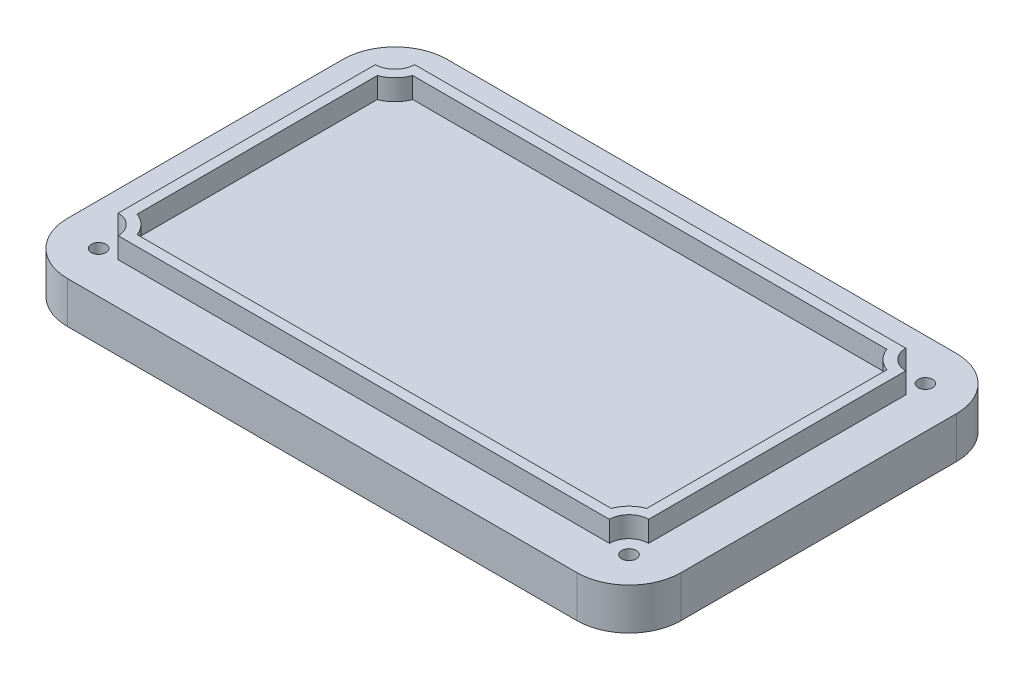
ISO-10303-21;
HEADER;
FILE_DESCRIPTION(('STEP AP214'),'2;1');
FILE_NAME('part.step','',(''),(''),'','','');
FILE_SCHEMA(('AUTOMOTIVE_DESIGN { 1 0 10303 214 1 1 1 1 }'));
ENDSEC;
DATA;
#1=APPLICATION_CONTEXT('core data for automotive mechanical design processes');
#2=APPLICATION_PROTOCOL_DEFINITION('international standard','automotive_design',2000,#1);
#3=PRODUCT_CONTEXT('',#1,'mechanical');
#4=PRODUCT('Part','Part','',(#3));
#5=PRODUCT_RELATED_PRODUCT_CATEGORY('part','',(#4));
#6=PRODUCT_DEFINITION_FORMATION('','',#4);
#7=PRODUCT_DEFINITION_CONTEXT('part definition',#1,'design');
#8=PRODUCT_DEFINITION('design','',#6,#7);
#9=PRODUCT_DEFINITION_SHAPE('','',#8);
#10=(LENGTH_UNIT() NAMED_UNIT(*) SI_UNIT(.MILLI.,.METRE.));
#11=(NAMED_UNIT(*) PLANE_ANGLE_UNIT() SI_UNIT($,.RADIAN.));
#12=(NAMED_UNIT(*) SI_UNIT($,.STERADIAN.) SOLID_ANGLE_UNIT());
#13=UNCERTAINTY_MEASURE_WITH_UNIT(LENGTH_MEASURE(1.E-05),#10,'distance_accuracy_value','');
#14=(GEOMETRIC_REPRESENTATION_CONTEXT(3) GLOBAL_UNCERTAINTY_ASSIGNED_CONTEXT((#13)) GLOBAL_UNIT_ASSIGNED_CONTEXT((#10,
#11,#12)) REPRESENTATION_CONTEXT('',''));
#15=CARTESIAN_POINT('',(0.,0.,0.));
#16=DIRECTION('',(0.,0.,1.));
#17=DIRECTION('',(1.,0.,0.));
#18=AXIS2_PLACEMENT_3D('',#15,#16,#17);
#19=CARTESIAN_POINT('',(-51.,8.,28.5));
#20=DIRECTION('',(0.,-1.,0.));
#21=DIRECTION('',(0.,0.,-1.));
#22=AXIS2_PLACEMENT_3D('',#19,#20,#21);
#23=CYLINDRICAL_SURFACE('',#22,1.4);
#24=CARTESIAN_POINT('',(-51.,8.,28.5));
#25=DIRECTION('',(0.,1.,0.));
#26=DIRECTION('',(0.,0.,1.));
#27=AXIS2_PLACEMENT_3D('',#24,#25,#26);
#28=CIRCLE('',#27,1.4);
#29=CARTESIAN_POINT('',(-51.,8.,29.9));
#30=VERTEX_POINT('',#29);
#31=EDGE_CURVE('E253',#30,#30,#28,.T.);
#32=ORIENTED_EDGE('',*,*,#31,.T.);
#33=EDGE_LOOP('',(#32));
#34=FACE_BOUND('',#33,.T.);
#35=CARTESIAN_POINT('',(-51.,3.,28.5));
#36=DIRECTION('',(0.,-1.,0.));
#37=DIRECTION('',(0.,0.,-1.));
#38=AXIS2_PLACEMENT_3D('',#35,#36,#37);
#39=CIRCLE('',#38,1.4);
#40=CARTESIAN_POINT('',(-51.,3.,27.1));
#41=VERTEX_POINT('',#40);
#42=EDGE_CURVE('E346',#41,#41,#39,.T.);
#43=ORIENTED_EDGE('',*,*,#42,.T.);
#44=EDGE_LOOP('',(#43));
#45=FACE_BOUND('',#44,.T.);
#46=ADVANCED_FACE('F41',(#34,#45),#23,.F.);
#47=CARTESIAN_POINT('',(51.,8.,-28.5));
#48=DIRECTION('',(0.,-1.,0.));
#49=DIRECTION('',(0.,0.,-1.));
#50=AXIS2_PLACEMENT_3D('',#47,#48,#49);
#51=CYLINDRICAL_SURFACE('',#50,1.4);
#52=CARTESIAN_POINT('',(51.,8.,-28.5));
#53=DIRECTION('',(0.,1.,0.));
#54=DIRECTION('',(0.,0.,1.));
#55=AXIS2_PLACEMENT_3D('',#52,#53,#54);
#56=CIRCLE('',#55,1.4);
#57=CARTESIAN_POINT('',(51.,8.,-27.1));
#58=VERTEX_POINT('',#57);
#59=EDGE_CURVE('E244',#58,#58,#56,.T.);
#60=ORIENTED_EDGE('',*,*,#59,.T.);
#61=EDGE_LOOP('',(#60));
#62=FACE_BOUND('',#61,.T.);
#63=CARTESIAN_POINT('',(51.,3.,-28.5));
#64=DIRECTION('',(0.,-1.,0.));
#65=DIRECTION('',(0.,0.,-1.));
#66=AXIS2_PLACEMENT_3D('',#63,#64,#65);
#67=CIRCLE('',#66,1.4);
#68=CARTESIAN_POINT('',(51.,3.,-29.9));
#69=VERTEX_POINT('',#68);
#70=EDGE_CURVE('E338',#69,#69,#67,.T.);
#71=ORIENTED_EDGE('',*,*,#70,.T.);
#72=EDGE_LOOP('',(#71));
#73=FACE_BOUND('',#72,.T.);
#74=ADVANCED_FACE('F43',(#62,#73),#51,.F.);
#75=CARTESIAN_POINT('',(59.,8.,0.));
#76=DIRECTION('',(-1.,0.,0.));
#77=DIRECTION('',(0.,0.,1.));
#78=AXIS2_PLACEMENT_3D('',#75,#76,#77);
#79=PLANE('',#78);
#80=DIRECTION('',(0.,0.,-1.));
#81=VECTOR('',#80,1.);
#82=CARTESIAN_POINT('',(59.,0.,0.));
#83=LINE('',#82,#81);
#84=CARTESIAN_POINT('',(59.,0.,26.5));
#85=VERTEX_POINT('',#84);
#86=CARTESIAN_POINT('',(59.,0.,-26.5));
#87=VERTEX_POINT('',#86);
#88=EDGE_CURVE('E287',#85,#87,#83,.T.);
#89=ORIENTED_EDGE('',*,*,#88,.T.);
#90=DIRECTION('',(0.,-1.,0.));
#91=VECTOR('',#90,1.);
#92=CARTESIAN_POINT('',(59.,8.,-26.5));
#93=LINE('',#92,#91);
#94=CARTESIAN_POINT('',(59.,8.,-26.5));
#95=VERTEX_POINT('',#94);
#96=EDGE_CURVE('E11',#95,#87,#93,.T.);
#97=ORIENTED_EDGE('',*,*,#96,.F.);
#98=DIRECTION('',(0.,0.,-1.));
#99=VECTOR('',#98,1.);
#100=CARTESIAN_POINT('',(59.,8.,0.));
#101=LINE('',#100,#99);
#102=CARTESIAN_POINT('',(59.,8.,26.5));
#103=VERTEX_POINT('',#102);
#104=EDGE_CURVE('E261',#103,#95,#101,.T.);
#105=ORIENTED_EDGE('',*,*,#104,.F.);
#106=DIRECTION('',(0.,-1.,0.));
#107=VECTOR('',#106,1.);
#108=CARTESIAN_POINT('',(59.,8.,26.5));
#109=LINE('',#108,#107);
#110=EDGE_CURVE('E286',#103,#85,#109,.T.);
#111=ORIENTED_EDGE('',*,*,#110,.T.);
#112=EDGE_LOOP('',(#89,#97,#105,#111));
#113=FACE_BOUND('',#112,.T.);
#114=ADVANCED_FACE('F558',(#113),#79,.F.);
#115=CARTESIAN_POINT('',(49.,8.,-26.5));
#116=DIRECTION('',(0.,-1.,0.));
#117=DIRECTION('',(0.,0.,-1.));
#118=AXIS2_PLACEMENT_3D('',#115,#116,#117);
#119=CYLINDRICAL_SURFACE('',#118,10.);
#120=CARTESIAN_POINT('',(49.,0.,-26.5));
#121=DIRECTION('',(0.,1.,0.));
#122=DIRECTION('',(0.,0.,1.));
#123=AXIS2_PLACEMENT_3D('',#120,#121,#122);
#124=CIRCLE('',#123,10.);
#125=CARTESIAN_POINT('',(49.,0.,-36.5));
#126=VERTEX_POINT('',#125);
#127=EDGE_CURVE('E291',#87,#126,#124,.T.);
#128=ORIENTED_EDGE('',*,*,#127,.T.);
#129=DIRECTION('',(0.,-1.,0.));
#130=VECTOR('',#129,1.);
#131=CARTESIAN_POINT('',(49.,8.,-36.5));
#132=LINE('',#131,#130);
#133=CARTESIAN_POINT('',(49.,8.,-36.5));
#134=VERTEX_POINT('',#133);
#135=EDGE_CURVE('E51',#134,#126,#132,.T.);
#136=ORIENTED_EDGE('',*,*,#135,.F.);
#137=CARTESIAN_POINT('',(49.,8.,-26.5));
#138=DIRECTION('',(0.,1.,0.));
#139=DIRECTION('',(0.,0.,1.));
#140=AXIS2_PLACEMENT_3D('',#137,#138,#139);
#141=CIRCLE('',#140,10.);
#142=EDGE_CURVE('E265',#95,#134,#141,.T.);
#143=ORIENTED_EDGE('',*,*,#142,.F.);
#144=ORIENTED_EDGE('',*,*,#96,.T.);
#145=EDGE_LOOP('',(#128,#136,#143,#144));
#146=FACE_BOUND('',#145,.T.);
#147=ADVANCED_FACE('F592',(#146),#119,.T.);
#148=CARTESIAN_POINT('',(0.,8.,-36.5));
#149=DIRECTION('',(0.,0.,1.));
#150=DIRECTION('',(1.,0.,0.));
#151=AXIS2_PLACEMENT_3D('',#148,#149,#150);
#152=PLANE('',#151);
#153=DIRECTION('',(-1.,0.,0.));
#154=VECTOR('',#153,1.);
#155=CARTESIAN_POINT('',(0.,0.,-36.5));
#156=LINE('',#155,#154);
#157=CARTESIAN_POINT('',(-49.,0.,-36.5));
#158=VERTEX_POINT('',#157);
#159=EDGE_CURVE('E295',#126,#158,#156,.T.);
#160=ORIENTED_EDGE('',*,*,#159,.T.);
#161=DIRECTION('',(0.,-1.,0.));
#162=VECTOR('',#161,1.);
#163=CARTESIAN_POINT('',(-49.,8.,-36.5));
#164=LINE('',#163,#162);
#165=CARTESIAN_POINT('',(-49.,8.,-36.5));
#166=VERTEX_POINT('',#165);
#167=EDGE_CURVE('E331',#166,#158,#164,.T.);
#168=ORIENTED_EDGE('',*,*,#167,.F.);
#169=DIRECTION('',(-1.,0.,0.));
#170=VECTOR('',#169,1.);
#171=CARTESIAN_POINT('',(0.,8.,-36.5));
#172=LINE('',#171,#170);
#173=EDGE_CURVE('E268',#134,#166,#172,.T.);
#174=ORIENTED_EDGE('',*,*,#173,.F.);
#175=ORIENTED_EDGE('',*,*,#135,.T.);
#176=EDGE_LOOP('',(#160,#168,#174,#175));
#177=FACE_BOUND('',#176,.T.);
#178=ADVANCED_FACE('F597',(#177),#152,.F.);
#179=CARTESIAN_POINT('',(-49.,8.,-26.5));
#180=DIRECTION('',(0.,-1.,0.));
#181=DIRECTION('',(0.,0.,-1.));
#182=AXIS2_PLACEMENT_3D('',#179,#180,#181);
#183=CYLINDRICAL_SURFACE('',#182,10.);
#184=CARTESIAN_POINT('',(-49.,0.,-26.5));
#185=DIRECTION('',(0.,1.,0.));
#186=DIRECTION('',(0.,0.,1.));
#187=AXIS2_PLACEMENT_3D('',#184,#185,#186);
#188=CIRCLE('',#187,10.);
#189=CARTESIAN_POINT('',(-59.,0.,-26.5));
#190=VERTEX_POINT('',#189);
#191=EDGE_CURVE('E298',#158,#190,#188,.T.);
#192=ORIENTED_EDGE('',*,*,#191,.T.);
#193=DIRECTION('',(0.,-1.,0.));
#194=VECTOR('',#193,1.);
#195=CARTESIAN_POINT('',(-59.,8.,-26.5));
#196=LINE('',#195,#194);
#197=CARTESIAN_POINT('',(-59.,8.,-26.5));
#198=VERTEX_POINT('',#197);
#199=EDGE_CURVE('E327',#198,#190,#196,.T.);
#200=ORIENTED_EDGE('',*,*,#199,.F.);
#201=CARTESIAN_POINT('',(-49.,8.,-26.5));
#202=DIRECTION('',(0.,1.,0.));
#203=DIRECTION('',(0.,0.,1.));
#204=AXIS2_PLACEMENT_3D('',#201,#202,#203);
#205=CIRCLE('',#204,10.);
#206=EDGE_CURVE('E271',#166,#198,#205,.T.);
#207=ORIENTED_EDGE('',*,*,#206,.F.);
#208=ORIENTED_EDGE('',*,*,#167,.T.);
#209=EDGE_LOOP('',(#192,#200,#207,#208));
#210=FACE_BOUND('',#209,.T.);
#211=ADVANCED_FACE('F603',(#210),#183,.T.);
#212=CARTESIAN_POINT('',(-59.,8.,0.));
#213=DIRECTION('',(1.,0.,0.));
#214=DIRECTION('',(0.,0.,-1.));
#215=AXIS2_PLACEMENT_3D('',#212,#213,#214);
#216=PLANE('',#215);
#217=DIRECTION('',(0.,0.,1.));
#218=VECTOR('',#217,1.);
#219=CARTESIAN_POINT('',(-59.,0.,0.));
#220=LINE('',#219,#218);
#221=CARTESIAN_POINT('',(-59.,0.,26.5));
#222=VERTEX_POINT('',#221);
#223=EDGE_CURVE('E301',#190,#222,#220,.T.);
#224=ORIENTED_EDGE('',*,*,#223,.T.);
#225=DIRECTION('',(0.,-1.,0.));
#226=VECTOR('',#225,1.);
#227=CARTESIAN_POINT('',(-59.,8.,26.5));
#228=LINE('',#227,#226);
#229=CARTESIAN_POINT('',(-59.,8.,26.5));
#230=VERTEX_POINT('',#229);
#231=EDGE_CURVE('E323',#230,#222,#228,.T.);
#232=ORIENTED_EDGE('',*,*,#231,.F.);
#233=DIRECTION('',(0.,0.,1.));
#234=VECTOR('',#233,1.);
#235=CARTESIAN_POINT('',(-59.,8.,0.));
#236=LINE('',#235,#234);
#237=EDGE_CURVE('E274',#198,#230,#236,.T.);
#238=ORIENTED_EDGE('',*,*,#237,.F.);
#239=ORIENTED_EDGE('',*,*,#199,.T.);
#240=EDGE_LOOP('',(#224,#232,#238,#239));
#241=FACE_BOUND('',#240,.T.);
#242=ADVANCED_FACE('F607',(#241),#216,.F.);
#243=CARTESIAN_POINT('',(-49.,8.,26.5));
#244=DIRECTION('',(0.,-1.,0.));
#245=DIRECTION('',(0.,0.,-1.));
#246=AXIS2_PLACEMENT_3D('',#243,#244,#245);
#247=CYLINDRICAL_SURFACE('',#246,10.);
#248=CARTESIAN_POINT('',(-49.,0.,26.5));
#249=DIRECTION('',(0.,1.,0.));
#250=DIRECTION('',(0.,0.,1.));
#251=AXIS2_PLACEMENT_3D('',#248,#249,#250);
#252=CIRCLE('',#251,10.);
#253=CARTESIAN_POINT('',(-49.,0.,36.5));
#254=VERTEX_POINT('',#253);
#255=EDGE_CURVE('E304',#222,#254,#252,.T.);
#256=ORIENTED_EDGE('',*,*,#255,.T.);
#257=DIRECTION('',(0.,-1.,0.));
#258=VECTOR('',#257,1.);
#259=CARTESIAN_POINT('',(-49.,8.,36.5));
#260=LINE('',#259,#258);
#261=CARTESIAN_POINT('',(-49.,8.,36.5));
#262=VERTEX_POINT('',#261);
#263=EDGE_CURVE('E319',#262,#254,#260,.T.);
#264=ORIENTED_EDGE('',*,*,#263,.F.);
#265=CARTESIAN_POINT('',(-49.,8.,26.5));
#266=DIRECTION('',(0.,1.,0.));
#267=DIRECTION('',(0.,0.,1.));
#268=AXIS2_PLACEMENT_3D('',#265,#266,#267);
#269=CIRCLE('',#268,10.);
#270=EDGE_CURVE('E277',#230,#262,#269,.T.);
#271=ORIENTED_EDGE('',*,*,#270,.F.);
#272=ORIENTED_EDGE('',*,*,#231,.T.);
#273=EDGE_LOOP('',(#256,#264,#271,#272));
#274=FACE_BOUND('',#273,.T.);
#275=ADVANCED_FACE('F612',(#274),#247,.T.);
#276=CARTESIAN_POINT('',(0.,8.,36.5));
#277=DIRECTION('',(0.,0.,-1.));
#278=DIRECTION('',(-1.,0.,0.));
#279=AXIS2_PLACEMENT_3D('',#276,#277,#278);
#280=PLANE('',#279);
#281=DIRECTION('',(1.,0.,0.));
#282=VECTOR('',#281,1.);
#283=CARTESIAN_POINT('',(0.,0.,36.5));
#284=LINE('',#283,#282);
#285=CARTESIAN_POINT('',(49.,0.,36.5));
#286=VERTEX_POINT('',#285);
#287=EDGE_CURVE('E307',#254,#286,#284,.T.);
#288=ORIENTED_EDGE('',*,*,#287,.T.);
#289=DIRECTION('',(0.,-1.,0.));
#290=VECTOR('',#289,1.);
#291=CARTESIAN_POINT('',(49.,8.,36.5));
#292=LINE('',#291,#290);
#293=CARTESIAN_POINT('',(49.,8.,36.5));
#294=VERTEX_POINT('',#293);
#295=EDGE_CURVE('E315',#294,#286,#292,.T.);
#296=ORIENTED_EDGE('',*,*,#295,.F.);
#297=DIRECTION('',(1.,0.,0.));
#298=VECTOR('',#297,1.);
#299=CARTESIAN_POINT('',(0.,8.,36.5));
#300=LINE('',#299,#298);
#301=EDGE_CURVE('E280',#262,#294,#300,.T.);
#302=ORIENTED_EDGE('',*,*,#301,.F.);
#303=ORIENTED_EDGE('',*,*,#263,.T.);
#304=EDGE_LOOP('',(#288,#296,#302,#303));
#305=FACE_BOUND('',#304,.T.);
#306=ADVANCED_FACE('F616',(#305),#280,.F.);
#307=CARTESIAN_POINT('',(49.,8.,26.5));
#308=DIRECTION('',(0.,-1.,0.));
#309=DIRECTION('',(0.,0.,-1.));
#310=AXIS2_PLACEMENT_3D('',#307,#308,#309);
#311=CYLINDRICAL_SURFACE('',#310,10.);
#312=CARTESIAN_POINT('',(49.,0.,26.5));
#313=DIRECTION('',(0.,1.,0.));
#314=DIRECTION('',(0.,0.,1.));
#315=AXIS2_PLACEMENT_3D('',#312,#313,#314);
#316=CIRCLE('',#315,10.);
#317=EDGE_CURVE('E249',#286,#85,#316,.T.);
#318=ORIENTED_EDGE('',*,*,#317,.T.);
#319=ORIENTED_EDGE('',*,*,#110,.F.);
#320=CARTESIAN_POINT('',(49.,8.,26.5));
#321=DIRECTION('',(0.,1.,0.));
#322=DIRECTION('',(0.,0.,1.));
#323=AXIS2_PLACEMENT_3D('',#320,#321,#322);
#324=CIRCLE('',#323,10.);
#325=EDGE_CURVE('E283',#294,#103,#324,.T.);
#326=ORIENTED_EDGE('',*,*,#325,.F.);
#327=ORIENTED_EDGE('',*,*,#295,.T.);
#328=EDGE_LOOP('',(#318,#319,#326,#327));
#329=FACE_BOUND('',#328,.T.);
#330=ADVANCED_FACE('F573',(#329),#311,.T.);
#331=CARTESIAN_POINT('',(-51.,8.,-28.5));
#332=DIRECTION('',(0.,-1.,0.));
#333=DIRECTION('',(0.,0.,-1.));
#334=AXIS2_PLACEMENT_3D('',#331,#332,#333);
#335=CYLINDRICAL_SURFACE('',#334,1.4);
#336=CARTESIAN_POINT('',(-51.,3.,-28.5));
#337=DIRECTION('',(0.,1.,0.));
#338=DIRECTION('',(0.,0.,1.));
#339=AXIS2_PLACEMENT_3D('',#336,#337,#338);
#340=CIRCLE('',#339,1.4);
#341=CARTESIAN_POINT('',(-51.,3.,-27.1));
#342=VERTEX_POINT('',#341);
#343=EDGE_CURVE('E45',#342,#342,#340,.T.);
#344=ORIENTED_EDGE('',*,*,#343,.F.);
#345=EDGE_LOOP('',(#344));
#346=FACE_BOUND('',#345,.T.);
#347=CARTESIAN_POINT('',(-51.,8.,-28.5));
#348=DIRECTION('',(0.,1.,0.));
#349=DIRECTION('',(0.,0.,1.));
#350=AXIS2_PLACEMENT_3D('',#347,#348,#349);
#351=CIRCLE('',#350,1.4);
#352=CARTESIAN_POINT('',(-51.,8.,-27.1));
#353=VERTEX_POINT('',#352);
#354=EDGE_CURVE('E257',#353,#353,#351,.T.);
#355=ORIENTED_EDGE('',*,*,#354,.T.);
#356=EDGE_LOOP('',(#355));
#357=FACE_BOUND('',#356,.T.);
#358=ADVANCED_FACE('F561',(#346,#357),#335,.F.);
#359=CARTESIAN_POINT('',(51.,8.,28.5));
#360=DIRECTION('',(0.,-1.,0.));
#361=DIRECTION('',(0.,0.,-1.));
#362=AXIS2_PLACEMENT_3D('',#359,#360,#361);
#363=CYLINDRICAL_SURFACE('',#362,1.4);
#364=CARTESIAN_POINT('',(51.,3.,28.5));
#365=DIRECTION('',(0.,1.,0.));
#366=DIRECTION('',(0.,0.,1.));
#367=AXIS2_PLACEMENT_3D('',#364,#365,#366);
#368=CIRCLE('',#367,1.4);
#369=CARTESIAN_POINT('',(51.,3.,29.9));
#370=VERTEX_POINT('',#369);
#371=EDGE_CURVE('E342',#370,#370,#368,.T.);
#372=ORIENTED_EDGE('',*,*,#371,.F.);
#373=EDGE_LOOP('',(#372));
#374=FACE_BOUND('',#373,.T.);
#375=CARTESIAN_POINT('',(51.,8.,28.5));
#376=DIRECTION('',(0.,1.,0.));
#377=DIRECTION('',(0.,0.,1.));
#378=AXIS2_PLACEMENT_3D('',#375,#376,#377);
#379=CIRCLE('',#378,1.4);
#380=CARTESIAN_POINT('',(51.,8.,29.9));
#381=VERTEX_POINT('',#380);
#382=EDGE_CURVE('E248',#381,#381,#379,.T.);
#383=ORIENTED_EDGE('',*,*,#382,.T.);
#384=EDGE_LOOP('',(#383));
#385=FACE_BOUND('',#384,.T.);
#386=ADVANCED_FACE('F563',(#374,#385),#363,.F.);
#387=CARTESIAN_POINT('',(0.,8.,0.));
#388=DIRECTION('',(0.,1.,0.));
#389=DIRECTION('',(0.,0.,1.));
#390=AXIS2_PLACEMENT_3D('',#387,#388,#389);
#391=PLANE('',#390);
#392=DIRECTION('',(-1.,0.,0.));
#393=VECTOR('',#392,1.);
#394=CARTESIAN_POINT('',(0.,8.,-28.5));
#395=LINE('',#394,#393);
#396=CARTESIAN_POINT('',(47.2349327781439,8.,-28.5));
#397=VERTEX_POINT('',#396);
#398=CARTESIAN_POINT('',(-47.2349327781439,8.,-28.5));
#399=VERTEX_POINT('',#398);
#400=EDGE_CURVE('E356',#397,#399,#395,.T.);
#401=ORIENTED_EDGE('',*,*,#400,.F.);
#402=CARTESIAN_POINT('',(51.,8.,-28.5));
#403=DIRECTION('',(0.,1.,0.));
#404=DIRECTION('',(0.,0.,1.));
#405=AXIS2_PLACEMENT_3D('',#402,#403,#404);
#406=CIRCLE('',#405,3.76506722185612);
#407=CARTESIAN_POINT('',(51.,8.,-24.7349327781439));
#408=VERTEX_POINT('',#407);
#409=EDGE_CURVE('E231',#408,#397,#406,.F.);
#410=ORIENTED_EDGE('',*,*,#409,.F.);
#411=DIRECTION('',(0.,0.,-1.));
#412=VECTOR('',#411,1.);
#413=CARTESIAN_POINT('',(51.,8.,0.));
#414=LINE('',#413,#412);
#415=CARTESIAN_POINT('',(51.,8.,24.7349327781439));
#416=VERTEX_POINT('',#415);
#417=EDGE_CURVE('E379',#416,#408,#414,.T.);
#418=ORIENTED_EDGE('',*,*,#417,.F.);
#419=CARTESIAN_POINT('',(50.9999999999999,8.,28.5));
#420=DIRECTION('',(0.,1.,0.));
#421=DIRECTION('',(0.,0.,1.));
#422=AXIS2_PLACEMENT_3D('',#419,#420,#421);
#423=CIRCLE('',#422,3.76506722185613);
#424=CARTESIAN_POINT('',(47.2349327781438,8.,28.5));
#425=VERTEX_POINT('',#424);
#426=EDGE_CURVE('E376',#425,#416,#423,.F.);
#427=ORIENTED_EDGE('',*,*,#426,.F.);
#428=DIRECTION('',(1.,0.,0.));
#429=VECTOR('',#428,1.);
#430=CARTESIAN_POINT('',(0.,8.,28.5));
#431=LINE('',#430,#429);
#432=CARTESIAN_POINT('',(-47.2349327781439,8.,28.5));
#433=VERTEX_POINT('',#432);
#434=EDGE_CURVE('E373',#433,#425,#431,.T.);
#435=ORIENTED_EDGE('',*,*,#434,.F.);
#436=CARTESIAN_POINT('',(-51.,8.,28.5));
#437=DIRECTION('',(0.,1.,0.));
#438=DIRECTION('',(0.,0.,1.));
#439=AXIS2_PLACEMENT_3D('',#436,#437,#438);
#440=CIRCLE('',#439,3.76506722185612);
#441=CARTESIAN_POINT('',(-51.,8.,24.7349327781439));
#442=VERTEX_POINT('',#441);
#443=EDGE_CURVE('E370',#442,#433,#440,.F.);
#444=ORIENTED_EDGE('',*,*,#443,.F.);
#445=DIRECTION('',(0.,0.,1.));
#446=VECTOR('',#445,1.);
#447=CARTESIAN_POINT('',(-51.,8.,0.));
#448=LINE('',#447,#446);
#449=CARTESIAN_POINT('',(-51.,8.,-24.7349327781439));
#450=VERTEX_POINT('',#449);
#451=EDGE_CURVE('E367',#450,#442,#448,.T.);
#452=ORIENTED_EDGE('',*,*,#451,.F.);
#453=CARTESIAN_POINT('',(-51.,8.,-28.5));
#454=DIRECTION('',(0.,1.,0.));
#455=DIRECTION('',(0.,0.,1.));
#456=AXIS2_PLACEMENT_3D('',#453,#454,#455);
#457=CIRCLE('',#456,3.76506722185612);
#458=EDGE_CURVE('E359',#399,#450,#457,.F.);
#459=ORIENTED_EDGE('',*,*,#458,.F.);
#460=EDGE_LOOP('',(#401,#410,#418,#427,#435,#444,#452,#459));
#461=FACE_BOUND('',#460,.T.);
#462=ORIENTED_EDGE('',*,*,#59,.F.);
#463=EDGE_LOOP('',(#462));
#464=FACE_BOUND('',#463,.T.);
#465=ORIENTED_EDGE('',*,*,#382,.F.);
#466=EDGE_LOOP('',(#465));
#467=FACE_BOUND('',#466,.T.);
#468=ORIENTED_EDGE('',*,*,#31,.F.);
#469=EDGE_LOOP('',(#468));
#470=FACE_BOUND('',#469,.T.);
#471=ORIENTED_EDGE('',*,*,#354,.F.);
#472=EDGE_LOOP('',(#471));
#473=FACE_BOUND('',#472,.T.);
#474=ORIENTED_EDGE('',*,*,#104,.T.);
#475=ORIENTED_EDGE('',*,*,#142,.T.);
#476=ORIENTED_EDGE('',*,*,#173,.T.);
#477=ORIENTED_EDGE('',*,*,#206,.T.);
#478=ORIENTED_EDGE('',*,*,#237,.T.);
#479=ORIENTED_EDGE('',*,*,#270,.T.);
#480=ORIENTED_EDGE('',*,*,#301,.T.);
#481=ORIENTED_EDGE('',*,*,#325,.T.);
#482=EDGE_LOOP('',(#474,#475,#476,#477,#478,#479,#480,#481));
#483=FACE_BOUND('',#482,.T.);
#484=ADVANCED_FACE('F459',(#461,#464,#467,#470,#473,#483),#391,.T.);
#485=CARTESIAN_POINT('',(0.,0.,0.));
#486=DIRECTION('',(0.,1.,0.));
#487=DIRECTION('',(0.,0.,1.));
#488=AXIS2_PLACEMENT_3D('',#485,#486,#487);
#489=PLANE('',#488);
#490=CARTESIAN_POINT('',(-51.,0.,-28.5));
#491=DIRECTION('',(0.,-1.,0.));
#492=DIRECTION('',(0.,0.,1.));
#493=AXIS2_PLACEMENT_3D('',#490,#491,#492);
#494=CIRCLE('',#493,3.5);
#495=CARTESIAN_POINT('',(-51.,0.,-25.));
#496=VERTEX_POINT('',#495);
#497=EDGE_CURVE('E969',#496,#496,#494,.T.);
#498=ORIENTED_EDGE('',*,*,#497,.F.);
#499=EDGE_LOOP('',(#498));
#500=FACE_BOUND('',#499,.T.);
#501=CARTESIAN_POINT('',(51.,0.,-28.5));
#502=DIRECTION('',(0.,-1.,0.));
#503=DIRECTION('',(0.,0.,-1.));
#504=AXIS2_PLACEMENT_3D('',#501,#502,#503);
#505=CIRCLE('',#504,3.5);
#506=CARTESIAN_POINT('',(51.,0.,-32.));
#507=VERTEX_POINT('',#506);
#508=EDGE_CURVE('E977',#507,#507,#505,.T.);
#509=ORIENTED_EDGE('',*,*,#508,.F.);
#510=EDGE_LOOP('',(#509));
#511=FACE_BOUND('',#510,.T.);
#512=CARTESIAN_POINT('',(51.,0.,28.5));
#513=DIRECTION('',(0.,-1.,0.));
#514=DIRECTION('',(0.,0.,1.));
#515=AXIS2_PLACEMENT_3D('',#512,#513,#514);
#516=CIRCLE('',#515,3.5);
#517=CARTESIAN_POINT('',(51.,0.,32.));
#518=VERTEX_POINT('',#517);
#519=EDGE_CURVE('E985',#518,#518,#516,.T.);
#520=ORIENTED_EDGE('',*,*,#519,.F.);
#521=EDGE_LOOP('',(#520));
#522=FACE_BOUND('',#521,.T.);
#523=CARTESIAN_POINT('',(-51.,0.,28.5));
#524=DIRECTION('',(0.,-1.,0.));
#525=DIRECTION('',(0.,0.,-1.));
#526=AXIS2_PLACEMENT_3D('',#523,#524,#525);
#527=CIRCLE('',#526,3.5);
#528=CARTESIAN_POINT('',(-51.,0.,25.));
#529=VERTEX_POINT('',#528);
#530=EDGE_CURVE('E961',#529,#529,#527,.T.);
#531=ORIENTED_EDGE('',*,*,#530,.F.);
#532=EDGE_LOOP('',(#531));
#533=FACE_BOUND('',#532,.T.);
#534=ORIENTED_EDGE('',*,*,#88,.F.);
#535=ORIENTED_EDGE('',*,*,#317,.F.);
#536=ORIENTED_EDGE('',*,*,#287,.F.);
#537=ORIENTED_EDGE('',*,*,#255,.F.);
#538=ORIENTED_EDGE('',*,*,#223,.F.);
#539=ORIENTED_EDGE('',*,*,#191,.F.);
#540=ORIENTED_EDGE('',*,*,#159,.F.);
#541=ORIENTED_EDGE('',*,*,#127,.F.);
#542=EDGE_LOOP('',(#534,#535,#536,#537,#538,#539,#540,#541));
#543=FACE_BOUND('',#542,.T.);
#544=ADVANCED_FACE('F570',(#500,#511,#522,#533,#543),#489,.F.);
#545=CARTESIAN_POINT('',(0.,12.,-26.5));
#546=DIRECTION('',(0.,0.,1.));
#547=DIRECTION('',(1.,0.,0.));
#548=AXIS2_PLACEMENT_3D('',#545,#546,#547);
#549=PLANE('',#548);
#550=DIRECTION('',(-1.,0.,0.));
#551=VECTOR('',#550,1.);
#552=CARTESIAN_POINT('',(0.,8.,-26.5));
#553=LINE('',#552,#551);
#554=CARTESIAN_POINT('',(45.5929675354664,8.,-26.5));
#555=VERTEX_POINT('',#554);
#556=CARTESIAN_POINT('',(-45.5929675354665,8.,-26.5));
#557=VERTEX_POINT('',#556);
#558=EDGE_CURVE('E382',#555,#557,#553,.T.);
#559=ORIENTED_EDGE('',*,*,#558,.F.);
#560=DIRECTION('',(0.,-1.,0.));
#561=VECTOR('',#560,1.);
#562=CARTESIAN_POINT('',(45.5929675354664,12.,-26.5));
#563=LINE('',#562,#561);
#564=CARTESIAN_POINT('',(45.5929675354664,12.,-26.5));
#565=VERTEX_POINT('',#564);
#566=EDGE_CURVE('E292',#565,#555,#563,.T.);
#567=ORIENTED_EDGE('',*,*,#566,.F.);
#568=DIRECTION('',(-1.,0.,0.));
#569=VECTOR('',#568,1.);
#570=CARTESIAN_POINT('',(0.,12.,-26.5));
#571=LINE('',#570,#569);
#572=CARTESIAN_POINT('',(-45.5929675354665,12.,-26.5));
#573=VERTEX_POINT('',#572);
#574=EDGE_CURVE('E485',#565,#573,#571,.T.);
#575=ORIENTED_EDGE('',*,*,#574,.T.);
#576=DIRECTION('',(0.,-1.,0.));
#577=VECTOR('',#576,1.);
#578=CARTESIAN_POINT('',(-45.5929675354665,12.,-26.5));
#579=LINE('',#578,#577);
#580=EDGE_CURVE('E234',#573,#557,#579,.T.);
#581=ORIENTED_EDGE('',*,*,#580,.T.);
#582=EDGE_LOOP('',(#559,#567,#575,#581));
#583=FACE_BOUND('',#582,.T.);
#584=ADVANCED_FACE('F518',(#583),#549,.T.);
#585=CARTESIAN_POINT('',(51.,12.,-28.5));
#586=DIRECTION('',(0.,-1.,0.));
#587=DIRECTION('',(0.,0.,-1.));
#588=AXIS2_PLACEMENT_3D('',#585,#586,#587);
#589=CYLINDRICAL_SURFACE('',#588,5.76506722185612);
#590=CARTESIAN_POINT('',(51.,8.,-28.5));
#591=DIRECTION('',(0.,1.,0.));
#592=DIRECTION('',(0.,0.,1.));
#593=AXIS2_PLACEMENT_3D('',#590,#591,#592);
#594=CIRCLE('',#593,5.76506722185612);
#595=CARTESIAN_POINT('',(49.,8.,-23.0929675354665));
#596=VERTEX_POINT('',#595);
#597=EDGE_CURVE('E386',#555,#596,#594,.T.);
#598=ORIENTED_EDGE('',*,*,#597,.T.);
#599=DIRECTION('',(0.,-1.,0.));
#600=VECTOR('',#599,1.);
#601=CARTESIAN_POINT('',(49.,12.,-23.0929675354665));
#602=LINE('',#601,#600);
#603=CARTESIAN_POINT('',(49.,12.,-23.0929675354665));
#604=VERTEX_POINT('',#603);
#605=EDGE_CURVE('E425',#604,#596,#602,.T.);
#606=ORIENTED_EDGE('',*,*,#605,.F.);
#607=CARTESIAN_POINT('',(51.,12.,-28.5));
#608=DIRECTION('',(0.,1.,0.));
#609=DIRECTION('',(0.,0.,1.));
#610=AXIS2_PLACEMENT_3D('',#607,#608,#609);
#611=CIRCLE('',#610,5.76506722185612);
#612=EDGE_CURVE('E489',#565,#604,#611,.T.);
#613=ORIENTED_EDGE('',*,*,#612,.F.);
#614=ORIENTED_EDGE('',*,*,#566,.T.);
#615=EDGE_LOOP('',(#598,#606,#613,#614));
#616=FACE_BOUND('',#615,.T.);
#617=ADVANCED_FACE('F523',(#616),#589,.T.);
#618=CARTESIAN_POINT('',(49.,12.,0.));
#619=DIRECTION('',(-1.,0.,0.));
#620=DIRECTION('',(0.,0.,1.));
#621=AXIS2_PLACEMENT_3D('',#618,#619,#620);
#622=PLANE('',#621);
#623=DIRECTION('',(0.,0.,-1.));
#624=VECTOR('',#623,1.);
#625=CARTESIAN_POINT('',(49.,8.,0.));
#626=LINE('',#625,#624);
#627=CARTESIAN_POINT('',(49.,8.,23.0929675354664));
#628=VERTEX_POINT('',#627);
#629=EDGE_CURVE('E390',#628,#596,#626,.T.);
#630=ORIENTED_EDGE('',*,*,#629,.F.);
#631=DIRECTION('',(0.,-1.,0.));
#632=VECTOR('',#631,1.);
#633=CARTESIAN_POINT('',(49.,12.,23.0929675354664));
#634=LINE('',#633,#632);
#635=CARTESIAN_POINT('',(49.,12.,23.0929675354664));
#636=VERTEX_POINT('',#635);
#637=EDGE_CURVE('E422',#636,#628,#634,.T.);
#638=ORIENTED_EDGE('',*,*,#637,.F.);
#639=DIRECTION('',(0.,0.,-1.));
#640=VECTOR('',#639,1.);
#641=CARTESIAN_POINT('',(49.,12.,0.));
#642=LINE('',#641,#640);
#643=EDGE_CURVE('E492',#636,#604,#642,.T.);
#644=ORIENTED_EDGE('',*,*,#643,.T.);
#645=ORIENTED_EDGE('',*,*,#605,.T.);
#646=EDGE_LOOP('',(#630,#638,#644,#645));
#647=FACE_BOUND('',#646,.T.);
#648=ADVANCED_FACE('F530',(#647),#622,.T.);
#649=CARTESIAN_POINT('',(50.9999999999999,12.,28.5));
#650=DIRECTION('',(0.,-1.,0.));
#651=DIRECTION('',(0.,0.,-1.));
#652=AXIS2_PLACEMENT_3D('',#649,#650,#651);
#653=CYLINDRICAL_SURFACE('',#652,5.76506722185613);
#654=CARTESIAN_POINT('',(50.9999999999999,8.,28.5));
#655=DIRECTION('',(0.,1.,0.));
#656=DIRECTION('',(0.,0.,1.));
#657=AXIS2_PLACEMENT_3D('',#654,#655,#656);
#658=CIRCLE('',#657,5.76506722185613);
#659=CARTESIAN_POINT('',(45.5929675354664,8.,26.5));
#660=VERTEX_POINT('',#659);
#661=EDGE_CURVE('E394',#628,#660,#658,.T.);
#662=ORIENTED_EDGE('',*,*,#661,.T.);
#663=DIRECTION('',(0.,-1.,0.));
#664=VECTOR('',#663,1.);
#665=CARTESIAN_POINT('',(45.5929675354664,12.,26.5));
#666=LINE('',#665,#664);
#667=CARTESIAN_POINT('',(45.5929675354664,12.,26.5));
#668=VERTEX_POINT('',#667);
#669=EDGE_CURVE('E419',#668,#660,#666,.T.);
#670=ORIENTED_EDGE('',*,*,#669,.F.);
#671=CARTESIAN_POINT('',(50.9999999999999,12.,28.5));
#672=DIRECTION('',(0.,1.,0.));
#673=DIRECTION('',(0.,0.,1.));
#674=AXIS2_PLACEMENT_3D('',#671,#672,#673);
#675=CIRCLE('',#674,5.76506722185613);
#676=EDGE_CURVE('E496',#636,#668,#675,.T.);
#677=ORIENTED_EDGE('',*,*,#676,.F.);
#678=ORIENTED_EDGE('',*,*,#637,.T.);
#679=EDGE_LOOP('',(#662,#670,#677,#678));
#680=FACE_BOUND('',#679,.T.);
#681=ADVANCED_FACE('F533',(#680),#653,.T.);
#682=CARTESIAN_POINT('',(0.,12.,26.5));
#683=DIRECTION('',(0.,0.,-1.));
#684=DIRECTION('',(-1.,0.,0.));
#685=AXIS2_PLACEMENT_3D('',#682,#683,#684);
#686=PLANE('',#685);
#687=DIRECTION('',(1.,0.,0.));
#688=VECTOR('',#687,1.);
#689=CARTESIAN_POINT('',(0.,8.,26.5));
#690=LINE('',#689,#688);
#691=CARTESIAN_POINT('',(-45.5929675354665,8.,26.5));
#692=VERTEX_POINT('',#691);
#693=EDGE_CURVE('E398',#692,#660,#690,.T.);
#694=ORIENTED_EDGE('',*,*,#693,.F.);
#695=DIRECTION('',(0.,-1.,0.));
#696=VECTOR('',#695,1.);
#697=CARTESIAN_POINT('',(-45.5929675354665,12.,26.5));
#698=LINE('',#697,#696);
#699=CARTESIAN_POINT('',(-45.5929675354665,12.,26.5));
#700=VERTEX_POINT('',#699);
#701=EDGE_CURVE('E416',#700,#692,#698,.T.);
#702=ORIENTED_EDGE('',*,*,#701,.F.);
#703=DIRECTION('',(1.,0.,0.));
#704=VECTOR('',#703,1.);
#705=CARTESIAN_POINT('',(0.,12.,26.5));
#706=LINE('',#705,#704);
#707=EDGE_CURVE('E499',#700,#668,#706,.T.);
#708=ORIENTED_EDGE('',*,*,#707,.T.);
#709=ORIENTED_EDGE('',*,*,#669,.T.);
#710=EDGE_LOOP('',(#694,#702,#708,#709));
#711=FACE_BOUND('',#710,.T.);
#712=ADVANCED_FACE('F536',(#711),#686,.T.);
#713=CARTESIAN_POINT('',(-51.,12.,28.5));
#714=DIRECTION('',(0.,-1.,0.));
#715=DIRECTION('',(0.,0.,-1.));
#716=AXIS2_PLACEMENT_3D('',#713,#714,#715);
#717=CYLINDRICAL_SURFACE('',#716,5.76506722185612);
#718=CARTESIAN_POINT('',(-51.,8.,28.5));
#719=DIRECTION('',(0.,1.,0.));
#720=DIRECTION('',(0.,0.,1.));
#721=AXIS2_PLACEMENT_3D('',#718,#719,#720);
#722=CIRCLE('',#721,5.76506722185612);
#723=CARTESIAN_POINT('',(-49.,8.,23.0929675354665));
#724=VERTEX_POINT('',#723);
#725=EDGE_CURVE('E402',#692,#724,#722,.T.);
#726=ORIENTED_EDGE('',*,*,#725,.T.);
#727=DIRECTION('',(0.,-1.,0.));
#728=VECTOR('',#727,1.);
#729=CARTESIAN_POINT('',(-49.,12.,23.0929675354665));
#730=LINE('',#729,#728);
#731=CARTESIAN_POINT('',(-49.,12.,23.0929675354665));
#732=VERTEX_POINT('',#731);
#733=EDGE_CURVE('E413',#732,#724,#730,.T.);
#734=ORIENTED_EDGE('',*,*,#733,.F.);
#735=CARTESIAN_POINT('',(-51.,12.,28.5));
#736=DIRECTION('',(0.,1.,0.));
#737=DIRECTION('',(0.,0.,1.));
#738=AXIS2_PLACEMENT_3D('',#735,#736,#737);
#739=CIRCLE('',#738,5.76506722185612);
#740=EDGE_CURVE('E503',#700,#732,#739,.T.);
#741=ORIENTED_EDGE('',*,*,#740,.F.);
#742=ORIENTED_EDGE('',*,*,#701,.T.);
#743=EDGE_LOOP('',(#726,#734,#741,#742));
#744=FACE_BOUND('',#743,.T.);
#745=ADVANCED_FACE('F540',(#744),#717,.T.);
#746=CARTESIAN_POINT('',(-49.,12.,0.));
#747=DIRECTION('',(1.,0.,0.));
#748=DIRECTION('',(0.,0.,-1.));
#749=AXIS2_PLACEMENT_3D('',#746,#747,#748);
#750=PLANE('',#749);
#751=DIRECTION('',(0.,0.,1.));
#752=VECTOR('',#751,1.);
#753=CARTESIAN_POINT('',(-49.,8.,0.));
#754=LINE('',#753,#752);
#755=CARTESIAN_POINT('',(-49.,8.,-23.0929675354664));
#756=VERTEX_POINT('',#755);
#757=EDGE_CURVE('E67',#756,#724,#754,.T.);
#758=ORIENTED_EDGE('',*,*,#757,.F.);
#759=DIRECTION('',(0.,-1.,0.));
#760=VECTOR('',#759,1.);
#761=CARTESIAN_POINT('',(-49.,12.,-23.0929675354664));
#762=LINE('',#761,#760);
#763=CARTESIAN_POINT('',(-49.,12.,-23.0929675354664));
#764=VERTEX_POINT('',#763);
#765=EDGE_CURVE('E238',#764,#756,#762,.T.);
#766=ORIENTED_EDGE('',*,*,#765,.F.);
#767=DIRECTION('',(0.,0.,1.));
#768=VECTOR('',#767,1.);
#769=CARTESIAN_POINT('',(-49.,12.,0.));
#770=LINE('',#769,#768);
#771=EDGE_CURVE('E505',#764,#732,#770,.T.);
#772=ORIENTED_EDGE('',*,*,#771,.T.);
#773=ORIENTED_EDGE('',*,*,#733,.T.);
#774=EDGE_LOOP('',(#758,#766,#772,#773));
#775=FACE_BOUND('',#774,.T.);
#776=ADVANCED_FACE('F542',(#775),#750,.T.);
#777=CARTESIAN_POINT('',(51.,12.,-28.5));
#778=DIRECTION('',(0.,-1.,0.));
#779=DIRECTION('',(0.,0.,-1.));
#780=AXIS2_PLACEMENT_3D('',#777,#778,#779);
#781=CYLINDRICAL_SURFACE('',#780,3.76506722185612);
#782=ORIENTED_EDGE('',*,*,#409,.T.);
#783=DIRECTION('',(0.,-1.,0.));
#784=VECTOR('',#783,1.);
#785=CARTESIAN_POINT('',(47.2349327781439,12.,-28.5));
#786=LINE('',#785,#784);
#787=CARTESIAN_POINT('',(47.2349327781439,12.,-28.5));
#788=VERTEX_POINT('',#787);
#789=EDGE_CURVE('E209',#788,#397,#786,.T.);
#790=ORIENTED_EDGE('',*,*,#789,.F.);
#791=CARTESIAN_POINT('',(51.,12.,-28.5));
#792=DIRECTION('',(0.,1.,0.));
#793=DIRECTION('',(0.,0.,1.));
#794=AXIS2_PLACEMENT_3D('',#791,#792,#793);
#795=CIRCLE('',#794,3.76506722185612);
#796=CARTESIAN_POINT('',(51.,12.,-24.7349327781439));
#797=VERTEX_POINT('',#796);
#798=EDGE_CURVE('E217',#797,#788,#795,.F.);
#799=ORIENTED_EDGE('',*,*,#798,.F.);
#800=DIRECTION('',(0.,-1.,0.));
#801=VECTOR('',#800,1.);
#802=CARTESIAN_POINT('',(51.,12.,-24.7349327781439));
#803=LINE('',#802,#801);
#804=EDGE_CURVE('E430',#797,#408,#803,.T.);
#805=ORIENTED_EDGE('',*,*,#804,.T.);
#806=EDGE_LOOP('',(#782,#790,#799,#805));
#807=FACE_BOUND('',#806,.T.);
#808=ADVANCED_FACE('F229',(#807),#781,.F.);
#809=CARTESIAN_POINT('',(0.,12.,-28.5));
#810=DIRECTION('',(0.,0.,1.));
#811=DIRECTION('',(1.,0.,0.));
#812=AXIS2_PLACEMENT_3D('',#809,#810,#811);
#813=PLANE('',#812);
#814=ORIENTED_EDGE('',*,*,#400,.T.);
#815=DIRECTION('',(0.,-1.,0.));
#816=VECTOR('',#815,1.);
#817=CARTESIAN_POINT('',(-47.2349327781439,12.,-28.5));
#818=LINE('',#817,#816);
#819=CARTESIAN_POINT('',(-47.2349327781439,12.,-28.5));
#820=VERTEX_POINT('',#819);
#821=EDGE_CURVE('E212',#820,#399,#818,.T.);
#822=ORIENTED_EDGE('',*,*,#821,.F.);
#823=DIRECTION('',(-1.,0.,0.));
#824=VECTOR('',#823,1.);
#825=CARTESIAN_POINT('',(0.,12.,-28.5));
#826=LINE('',#825,#824);
#827=EDGE_CURVE('E205',#788,#820,#826,.T.);
#828=ORIENTED_EDGE('',*,*,#827,.F.);
#829=ORIENTED_EDGE('',*,*,#789,.T.);
#830=EDGE_LOOP('',(#814,#822,#828,#829));
#831=FACE_BOUND('',#830,.T.);
#832=ADVANCED_FACE('F207',(#831),#813,.F.);
#833=CARTESIAN_POINT('',(-51.,12.,-28.5));
#834=DIRECTION('',(0.,-1.,0.));
#835=DIRECTION('',(0.,0.,-1.));
#836=AXIS2_PLACEMENT_3D('',#833,#834,#835);
#837=CYLINDRICAL_SURFACE('',#836,3.76506722185612);
#838=ORIENTED_EDGE('',*,*,#458,.T.);
#839=DIRECTION('',(0.,-1.,0.));
#840=VECTOR('',#839,1.);
#841=CARTESIAN_POINT('',(-51.,12.,-24.7349327781439));
#842=LINE('',#841,#840);
#843=CARTESIAN_POINT('',(-51.,12.,-24.7349327781439));
#844=VERTEX_POINT('',#843);
#845=EDGE_CURVE('E240',#844,#450,#842,.T.);
#846=ORIENTED_EDGE('',*,*,#845,.F.);
#847=CARTESIAN_POINT('',(-51.,12.,-28.5));
#848=DIRECTION('',(0.,1.,0.));
#849=DIRECTION('',(0.,0.,1.));
#850=AXIS2_PLACEMENT_3D('',#847,#848,#849);
#851=CIRCLE('',#850,3.76506722185612);
#852=EDGE_CURVE('E216',#820,#844,#851,.F.);
#853=ORIENTED_EDGE('',*,*,#852,.F.);
#854=ORIENTED_EDGE('',*,*,#821,.T.);
#855=EDGE_LOOP('',(#838,#846,#853,#854));
#856=FACE_BOUND('',#855,.T.);
#857=ADVANCED_FACE('F803',(#856),#837,.F.);
#858=CARTESIAN_POINT('',(-51.,12.,0.));
#859=DIRECTION('',(1.,0.,0.));
#860=DIRECTION('',(0.,0.,-1.));
#861=AXIS2_PLACEMENT_3D('',#858,#859,#860);
#862=PLANE('',#861);
#863=ORIENTED_EDGE('',*,*,#451,.T.);
#864=DIRECTION('',(0.,-1.,0.));
#865=VECTOR('',#864,1.);
#866=CARTESIAN_POINT('',(-51.,12.,24.7349327781439));
#867=LINE('',#866,#865);
#868=CARTESIAN_POINT('',(-51.,12.,24.7349327781439));
#869=VERTEX_POINT('',#868);
#870=EDGE_CURVE('E443',#869,#442,#867,.T.);
#871=ORIENTED_EDGE('',*,*,#870,.F.);
#872=DIRECTION('',(0.,0.,1.));
#873=VECTOR('',#872,1.);
#874=CARTESIAN_POINT('',(-51.,12.,0.));
#875=LINE('',#874,#873);
#876=EDGE_CURVE('E454',#844,#869,#875,.T.);
#877=ORIENTED_EDGE('',*,*,#876,.F.);
#878=ORIENTED_EDGE('',*,*,#845,.T.);
#879=EDGE_LOOP('',(#863,#871,#877,#878));
#880=FACE_BOUND('',#879,.T.);
#881=ADVANCED_FACE('F452',(#880),#862,.F.);
#882=CARTESIAN_POINT('',(-51.,12.,28.5));
#883=DIRECTION('',(0.,-1.,0.));
#884=DIRECTION('',(0.,0.,-1.));
#885=AXIS2_PLACEMENT_3D('',#882,#883,#884);
#886=CYLINDRICAL_SURFACE('',#885,3.76506722185612);
#887=ORIENTED_EDGE('',*,*,#443,.T.);
#888=DIRECTION('',(0.,-1.,0.));
#889=VECTOR('',#888,1.);
#890=CARTESIAN_POINT('',(-47.2349327781439,12.,28.5));
#891=LINE('',#890,#889);
#892=CARTESIAN_POINT('',(-47.2349327781439,12.,28.5));
#893=VERTEX_POINT('',#892);
#894=EDGE_CURVE('E439',#893,#433,#891,.T.);
#895=ORIENTED_EDGE('',*,*,#894,.F.);
#896=CARTESIAN_POINT('',(-51.,12.,28.5));
#897=DIRECTION('',(0.,1.,0.));
#898=DIRECTION('',(0.,0.,1.));
#899=AXIS2_PLACEMENT_3D('',#896,#897,#898);
#900=CIRCLE('',#899,3.76506722185612);
#901=EDGE_CURVE('E475',#869,#893,#900,.F.);
#902=ORIENTED_EDGE('',*,*,#901,.F.);
#903=ORIENTED_EDGE('',*,*,#870,.T.);
#904=EDGE_LOOP('',(#887,#895,#902,#903));
#905=FACE_BOUND('',#904,.T.);
#906=ADVANCED_FACE('F465',(#905),#886,.F.);
#907=CARTESIAN_POINT('',(0.,12.,28.5));
#908=DIRECTION('',(0.,0.,-1.));
#909=DIRECTION('',(-1.,0.,0.));
#910=AXIS2_PLACEMENT_3D('',#907,#908,#909);
#911=PLANE('',#910);
#912=ORIENTED_EDGE('',*,*,#434,.T.);
#913=DIRECTION('',(0.,-1.,0.));
#914=VECTOR('',#913,1.);
#915=CARTESIAN_POINT('',(47.2349327781438,12.,28.5));
#916=LINE('',#915,#914);
#917=CARTESIAN_POINT('',(47.2349327781438,12.,28.5));
#918=VERTEX_POINT('',#917);
#919=EDGE_CURVE('E435',#918,#425,#916,.T.);
#920=ORIENTED_EDGE('',*,*,#919,.F.);
#921=DIRECTION('',(1.,0.,0.));
#922=VECTOR('',#921,1.);
#923=CARTESIAN_POINT('',(0.,12.,28.5));
#924=LINE('',#923,#922);
#925=EDGE_CURVE('E471',#893,#918,#924,.T.);
#926=ORIENTED_EDGE('',*,*,#925,.F.);
#927=ORIENTED_EDGE('',*,*,#894,.T.);
#928=EDGE_LOOP('',(#912,#920,#926,#927));
#929=FACE_BOUND('',#928,.T.);
#930=ADVANCED_FACE('F469',(#929),#911,.F.);
#931=CARTESIAN_POINT('',(50.9999999999999,12.,28.5));
#932=DIRECTION('',(0.,-1.,0.));
#933=DIRECTION('',(0.,0.,-1.));
#934=AXIS2_PLACEMENT_3D('',#931,#932,#933);
#935=CYLINDRICAL_SURFACE('',#934,3.76506722185613);
#936=ORIENTED_EDGE('',*,*,#426,.T.);
#937=DIRECTION('',(0.,-1.,0.));
#938=VECTOR('',#937,1.);
#939=CARTESIAN_POINT('',(51.,12.,24.7349327781439));
#940=LINE('',#939,#938);
#941=CARTESIAN_POINT('',(51.,12.,24.7349327781439));
#942=VERTEX_POINT('',#941);
#943=EDGE_CURVE('E59',#942,#416,#940,.T.);
#944=ORIENTED_EDGE('',*,*,#943,.F.);
#945=CARTESIAN_POINT('',(50.9999999999999,12.,28.5));
#946=DIRECTION('',(0.,1.,0.));
#947=DIRECTION('',(0.,0.,1.));
#948=AXIS2_PLACEMENT_3D('',#945,#946,#947);
#949=CIRCLE('',#948,3.76506722185613);
#950=EDGE_CURVE('E474',#918,#942,#949,.F.);
#951=ORIENTED_EDGE('',*,*,#950,.F.);
#952=ORIENTED_EDGE('',*,*,#919,.T.);
#953=EDGE_LOOP('',(#936,#944,#951,#952));
#954=FACE_BOUND('',#953,.T.);
#955=ADVANCED_FACE('F788',(#954),#935,.F.);
#956=CARTESIAN_POINT('',(51.,12.,0.));
#957=DIRECTION('',(-1.,0.,0.));
#958=DIRECTION('',(0.,0.,1.));
#959=AXIS2_PLACEMENT_3D('',#956,#957,#958);
#960=PLANE('',#959);
#961=ORIENTED_EDGE('',*,*,#417,.T.);
#962=ORIENTED_EDGE('',*,*,#804,.F.);
#963=DIRECTION('',(0.,0.,-1.));
#964=VECTOR('',#963,1.);
#965=CARTESIAN_POINT('',(51.,12.,0.));
#966=LINE('',#965,#964);
#967=EDGE_CURVE('E222',#942,#797,#966,.T.);
#968=ORIENTED_EDGE('',*,*,#967,.F.);
#969=ORIENTED_EDGE('',*,*,#943,.T.);
#970=EDGE_LOOP('',(#961,#962,#968,#969));
#971=FACE_BOUND('',#970,.T.);
#972=ADVANCED_FACE('F784',(#971),#960,.F.);
#973=CARTESIAN_POINT('',(-51.,12.,-28.5));
#974=DIRECTION('',(0.,-1.,0.));
#975=DIRECTION('',(0.,0.,-1.));
#976=AXIS2_PLACEMENT_3D('',#973,#974,#975);
#977=CYLINDRICAL_SURFACE('',#976,5.76506722185612);
#978=CARTESIAN_POINT('',(-51.,8.,-28.5));
#979=DIRECTION('',(0.,1.,0.));
#980=DIRECTION('',(0.,0.,1.));
#981=AXIS2_PLACEMENT_3D('',#978,#979,#980);
#982=CIRCLE('',#981,5.76506722185612);
#983=EDGE_CURVE('E227',#756,#557,#982,.T.);
#984=ORIENTED_EDGE('',*,*,#983,.T.);
#985=ORIENTED_EDGE('',*,*,#580,.F.);
#986=CARTESIAN_POINT('',(-51.,12.,-28.5));
#987=DIRECTION('',(0.,1.,0.));
#988=DIRECTION('',(0.,0.,1.));
#989=AXIS2_PLACEMENT_3D('',#986,#987,#988);
#990=CIRCLE('',#989,5.76506722185612);
#991=EDGE_CURVE('E362',#764,#573,#990,.T.);
#992=ORIENTED_EDGE('',*,*,#991,.F.);
#993=ORIENTED_EDGE('',*,*,#765,.T.);
#994=EDGE_LOOP('',(#984,#985,#992,#993));
#995=FACE_BOUND('',#994,.T.);
#996=ADVANCED_FACE('F514',(#995),#977,.T.);
#997=CARTESIAN_POINT('',(0.,12.,0.));
#998=DIRECTION('',(0.,1.,0.));
#999=DIRECTION('',(0.,0.,1.));
#1000=AXIS2_PLACEMENT_3D('',#997,#998,#999);
#1001=PLANE('',#1000);
#1002=ORIENTED_EDGE('',*,*,#798,.T.);
#1003=ORIENTED_EDGE('',*,*,#827,.T.);
#1004=ORIENTED_EDGE('',*,*,#852,.T.);
#1005=ORIENTED_EDGE('',*,*,#876,.T.);
#1006=ORIENTED_EDGE('',*,*,#901,.T.);
#1007=ORIENTED_EDGE('',*,*,#925,.T.);
#1008=ORIENTED_EDGE('',*,*,#950,.T.);
#1009=ORIENTED_EDGE('',*,*,#967,.T.);
#1010=EDGE_LOOP('',(#1002,#1003,#1004,#1005,#1006,#1007,#1008,#1009));
#1011=FACE_BOUND('',#1010,.T.);
#1012=ORIENTED_EDGE('',*,*,#574,.F.);
#1013=ORIENTED_EDGE('',*,*,#612,.T.);
#1014=ORIENTED_EDGE('',*,*,#643,.F.);
#1015=ORIENTED_EDGE('',*,*,#676,.T.);
#1016=ORIENTED_EDGE('',*,*,#707,.F.);
#1017=ORIENTED_EDGE('',*,*,#740,.T.);
#1018=ORIENTED_EDGE('',*,*,#771,.F.);
#1019=ORIENTED_EDGE('',*,*,#991,.T.);
#1020=EDGE_LOOP('',(#1012,#1013,#1014,#1015,#1016,#1017,#1018,#1019));
#1021=FACE_BOUND('',#1020,.T.);
#1022=ADVANCED_FACE('F220',(#1011,#1021),#1001,.T.);
#1023=ORIENTED_EDGE('',*,*,#558,.T.);
#1024=ORIENTED_EDGE('',*,*,#983,.F.);
#1025=ORIENTED_EDGE('',*,*,#757,.T.);
#1026=ORIENTED_EDGE('',*,*,#725,.F.);
#1027=ORIENTED_EDGE('',*,*,#693,.T.);
#1028=ORIENTED_EDGE('',*,*,#661,.F.);
#1029=ORIENTED_EDGE('',*,*,#629,.T.);
#1030=ORIENTED_EDGE('',*,*,#597,.F.);
#1031=EDGE_LOOP('',(#1023,#1024,#1025,#1026,#1027,#1028,#1029,#1030));
#1032=FACE_BOUND('',#1031,.T.);
#1033=ADVANCED_FACE('F572',(#1032),#391,.T.);
#1034=CARTESIAN_POINT('',(-51.,3.,28.5));
#1035=DIRECTION('',(0.,-1.,0.));
#1036=DIRECTION('',(0.,0.,-1.));
#1037=AXIS2_PLACEMENT_3D('',#1034,#1035,#1036);
#1038=CYLINDRICAL_SURFACE('',#1037,3.5);
#1039=CARTESIAN_POINT('',(-51.,3.,28.5));
#1040=DIRECTION('',(0.,-1.,0.));
#1041=DIRECTION('',(0.,0.,-1.));
#1042=AXIS2_PLACEMENT_3D('',#1039,#1040,#1041);
#1043=CIRCLE('',#1042,3.5);
#1044=CARTESIAN_POINT('',(-51.,3.,25.));
#1045=VERTEX_POINT('',#1044);
#1046=EDGE_CURVE('E343',#1045,#1045,#1043,.T.);
#1047=ORIENTED_EDGE('',*,*,#1046,.F.);
#1048=EDGE_LOOP('',(#1047));
#1049=FACE_BOUND('',#1048,.T.);
#1050=ORIENTED_EDGE('',*,*,#530,.T.);
#1051=EDGE_LOOP('',(#1050));
#1052=FACE_BOUND('',#1051,.T.);
#1053=ADVANCED_FACE('F700',(#1049,#1052),#1038,.F.);
#1054=CARTESIAN_POINT('',(-51.,3.,28.5));
#1055=DIRECTION('',(0.,-1.,0.));
#1056=DIRECTION('',(0.,0.,-1.));
#1057=AXIS2_PLACEMENT_3D('',#1054,#1055,#1056);
#1058=PLANE('',#1057);
#1059=ORIENTED_EDGE('',*,*,#42,.F.);
#1060=EDGE_LOOP('',(#1059));
#1061=FACE_BOUND('',#1060,.T.);
#1062=ORIENTED_EDGE('',*,*,#1046,.T.);
#1063=EDGE_LOOP('',(#1062));
#1064=FACE_BOUND('',#1063,.T.);
#1065=ADVANCED_FACE('F705',(#1061,#1064),#1058,.T.);
#1066=CARTESIAN_POINT('',(51.,3.,28.5));
#1067=DIRECTION('',(0.,-1.,0.));
#1068=DIRECTION('',(0.,0.,-1.));
#1069=AXIS2_PLACEMENT_3D('',#1066,#1067,#1068);
#1070=CYLINDRICAL_SURFACE('',#1069,3.5);
#1071=CARTESIAN_POINT('',(51.,3.,28.5));
#1072=DIRECTION('',(0.,-1.,0.));
#1073=DIRECTION('',(0.,0.,1.));
#1074=AXIS2_PLACEMENT_3D('',#1071,#1072,#1073);
#1075=CIRCLE('',#1074,3.5);
#1076=CARTESIAN_POINT('',(51.,3.,32.));
#1077=VERTEX_POINT('',#1076);
#1078=EDGE_CURVE('E965',#1077,#1077,#1075,.T.);
#1079=ORIENTED_EDGE('',*,*,#1078,.F.);
#1080=EDGE_LOOP('',(#1079));
#1081=FACE_BOUND('',#1080,.T.);
#1082=ORIENTED_EDGE('',*,*,#519,.T.);
#1083=EDGE_LOOP('',(#1082));
#1084=FACE_BOUND('',#1083,.T.);
#1085=ADVANCED_FACE('F717',(#1081,#1084),#1070,.F.);
#1086=CARTESIAN_POINT('',(51.,3.,28.5));
#1087=DIRECTION('',(0.,1.,0.));
#1088=DIRECTION('',(0.,0.,1.));
#1089=AXIS2_PLACEMENT_3D('',#1086,#1087,#1088);
#1090=PLANE('',#1089);
#1091=ORIENTED_EDGE('',*,*,#371,.T.);
#1092=EDGE_LOOP('',(#1091));
#1093=FACE_BOUND('',#1092,.T.);
#1094=ORIENTED_EDGE('',*,*,#1078,.T.);
#1095=EDGE_LOOP('',(#1094));
#1096=FACE_BOUND('',#1095,.T.);
#1097=ADVANCED_FACE('F727',(#1093,#1096),#1090,.F.);
#1098=CARTESIAN_POINT('',(51.,3.,-28.5));
#1099=DIRECTION('',(0.,-1.,0.));
#1100=DIRECTION('',(0.,0.,-1.));
#1101=AXIS2_PLACEMENT_3D('',#1098,#1099,#1100);
#1102=CYLINDRICAL_SURFACE('',#1101,3.5);
#1103=CARTESIAN_POINT('',(51.,3.,-28.5));
#1104=DIRECTION('',(0.,-1.,0.));
#1105=DIRECTION('',(0.,0.,-1.));
#1106=AXIS2_PLACEMENT_3D('',#1103,#1104,#1105);
#1107=CIRCLE('',#1106,3.5);
#1108=CARTESIAN_POINT('',(51.,3.,-32.));
#1109=VERTEX_POINT('',#1108);
#1110=EDGE_CURVE('E981',#1109,#1109,#1107,.T.);
#1111=ORIENTED_EDGE('',*,*,#1110,.F.);
#1112=EDGE_LOOP('',(#1111));
#1113=FACE_BOUND('',#1112,.T.);
#1114=ORIENTED_EDGE('',*,*,#508,.T.);
#1115=EDGE_LOOP('',(#1114));
#1116=FACE_BOUND('',#1115,.T.);
#1117=ADVANCED_FACE('F737',(#1113,#1116),#1102,.F.);
#1118=CARTESIAN_POINT('',(51.,3.,-28.5));
#1119=DIRECTION('',(0.,-1.,0.));
#1120=DIRECTION('',(0.,0.,-1.));
#1121=AXIS2_PLACEMENT_3D('',#1118,#1119,#1120);
#1122=PLANE('',#1121);
#1123=ORIENTED_EDGE('',*,*,#70,.F.);
#1124=EDGE_LOOP('',(#1123));
#1125=FACE_BOUND('',#1124,.T.);
#1126=ORIENTED_EDGE('',*,*,#1110,.T.);
#1127=EDGE_LOOP('',(#1126));
#1128=FACE_BOUND('',#1127,.T.);
#1129=ADVANCED_FACE('F747',(#1125,#1128),#1122,.T.);
#1130=CARTESIAN_POINT('',(-51.,3.,-28.5));
#1131=DIRECTION('',(0.,-1.,0.));
#1132=DIRECTION('',(0.,0.,-1.));
#1133=AXIS2_PLACEMENT_3D('',#1130,#1131,#1132);
#1134=CYLINDRICAL_SURFACE('',#1133,3.5);
#1135=CARTESIAN_POINT('',(-51.,3.,-28.5));
#1136=DIRECTION('',(0.,-1.,0.));
#1137=DIRECTION('',(0.,0.,1.));
#1138=AXIS2_PLACEMENT_3D('',#1135,#1136,#1137);
#1139=CIRCLE('',#1138,3.5);
#1140=CARTESIAN_POINT('',(-51.,3.,-25.));
#1141=VERTEX_POINT('',#1140);
#1142=EDGE_CURVE('E973',#1141,#1141,#1139,.T.);
#1143=ORIENTED_EDGE('',*,*,#1142,.F.);
#1144=EDGE_LOOP('',(#1143));
#1145=FACE_BOUND('',#1144,.T.);
#1146=ORIENTED_EDGE('',*,*,#497,.T.);
#1147=EDGE_LOOP('',(#1146));
#1148=FACE_BOUND('',#1147,.T.);
#1149=ADVANCED_FACE('F757',(#1145,#1148),#1134,.F.);
#1150=CARTESIAN_POINT('',(-51.,3.,-28.5));
#1151=DIRECTION('',(0.,1.,0.));
#1152=DIRECTION('',(0.,0.,1.));
#1153=AXIS2_PLACEMENT_3D('',#1150,#1151,#1152);
#1154=PLANE('',#1153);
#1155=ORIENTED_EDGE('',*,*,#343,.T.);
#1156=EDGE_LOOP('',(#1155));
#1157=FACE_BOUND('',#1156,.T.);
#1158=ORIENTED_EDGE('',*,*,#1142,.T.);
#1159=EDGE_LOOP('',(#1158));
#1160=FACE_BOUND('',#1159,.T.);
#1161=ADVANCED_FACE('F767',(#1157,#1160),#1154,.F.);
#1162=CLOSED_SHELL('',(#46,#74,#114,#147,#178,#211,#242,#275,#306,#330,#358,#386,#484,#544,#584,
#617,#648,#681,#712,#745,#776,#808,#832,#857,#881,#906,#930,#955,#972,#996,#1022,#1033,#1053,
#1065,#1085,#1097,#1117,#1129,#1149,#1161));
#1163=MANIFOLD_SOLID_BREP('B2',#1162);
#1164=ADVANCED_BREP_SHAPE_REPRESENTATION('',(#18,#1163),#14);
#1165=SHAPE_DEFINITION_REPRESENTATION(#9,#1164);
ENDSEC;
END-ISO-10303-21;
